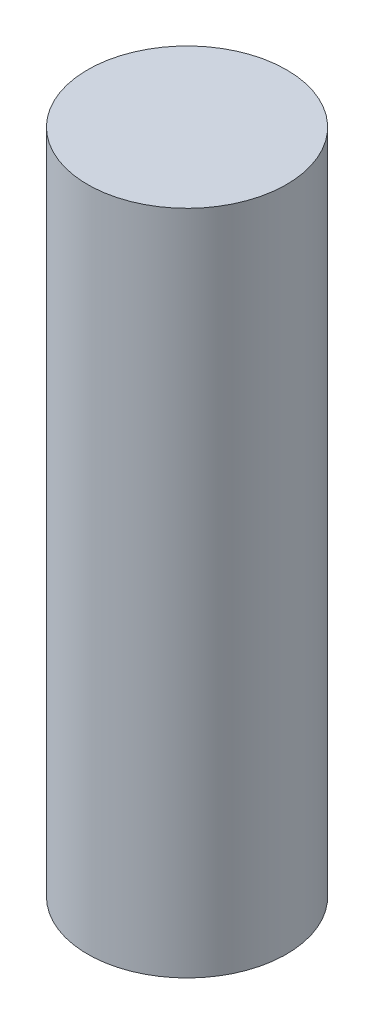
ISO-10303-21;
HEADER;
FILE_DESCRIPTION(('STEP AP214'),'2;1');
FILE_NAME('part.step','',(''),(''),'','','');
FILE_SCHEMA(('AUTOMOTIVE_DESIGN { 1 0 10303 214 1 1 1 1 }'));
ENDSEC;
DATA;
#1=APPLICATION_CONTEXT('core data for automotive mechanical design processes');
#2=APPLICATION_PROTOCOL_DEFINITION('international standard','automotive_design',2000,#1);
#3=PRODUCT_CONTEXT('',#1,'mechanical');
#4=PRODUCT('Part','Part','',(#3));
#5=PRODUCT_RELATED_PRODUCT_CATEGORY('part','',(#4));
#6=PRODUCT_DEFINITION_FORMATION('','',#4);
#7=PRODUCT_DEFINITION_CONTEXT('part definition',#1,'design');
#8=PRODUCT_DEFINITION('design','',#6,#7);
#9=PRODUCT_DEFINITION_SHAPE('','',#8);
#10=(LENGTH_UNIT() NAMED_UNIT(*) SI_UNIT(.MILLI.,.METRE.));
#11=(NAMED_UNIT(*) PLANE_ANGLE_UNIT() SI_UNIT($,.RADIAN.));
#12=(NAMED_UNIT(*) SI_UNIT($,.STERADIAN.) SOLID_ANGLE_UNIT());
#13=UNCERTAINTY_MEASURE_WITH_UNIT(LENGTH_MEASURE(1.E-05),#10,'distance_accuracy_value','');
#14=(GEOMETRIC_REPRESENTATION_CONTEXT(3) GLOBAL_UNCERTAINTY_ASSIGNED_CONTEXT((#13)) GLOBAL_UNIT_ASSIGNED_CONTEXT((#10,
#11,#12)) REPRESENTATION_CONTEXT('',''));
#15=CARTESIAN_POINT('',(0.,0.,0.));
#16=DIRECTION('',(0.,0.,1.));
#17=DIRECTION('',(1.,0.,0.));
#18=AXIS2_PLACEMENT_3D('',#15,#16,#17);
#19=CARTESIAN_POINT('',(0.,68.75,0.));
#20=DIRECTION('',(0.,-1.,0.));
#21=DIRECTION('',(0.,0.,-1.));
#22=AXIS2_PLACEMENT_3D('',#19,#20,#21);
#23=CYLINDRICAL_SURFACE('',#22,10.25);
#24=CARTESIAN_POINT('',(0.,68.75,0.));
#25=DIRECTION('',(0.,-1.,0.));
#26=DIRECTION('',(0.,0.,-1.));
#27=AXIS2_PLACEMENT_3D('',#24,#25,#26);
#28=CIRCLE('',#27,10.25);
#29=CARTESIAN_POINT('',(0.,68.75,-10.25));
#30=VERTEX_POINT('',#29);
#31=EDGE_CURVE('E10',#30,#30,#28,.T.);
#32=ORIENTED_EDGE('',*,*,#31,.T.);
#33=EDGE_LOOP('',(#32));
#34=FACE_BOUND('',#33,.T.);
#35=CARTESIAN_POINT('',(0.,0.0499999999999996,0.));
#36=DIRECTION('',(0.,-1.,0.));
#37=DIRECTION('',(0.,0.,-1.));
#38=AXIS2_PLACEMENT_3D('',#35,#36,#37);
#39=CIRCLE('',#38,10.25);
#40=CARTESIAN_POINT('',(0.,0.0499999999999996,-10.25));
#41=VERTEX_POINT('',#40);
#42=EDGE_CURVE('E43',#41,#41,#39,.T.);
#43=ORIENTED_EDGE('',*,*,#42,.F.);
#44=EDGE_LOOP('',(#43));
#45=FACE_BOUND('',#44,.T.);
#46=ADVANCED_FACE('F40',(#34,#45),#23,.T.);
#47=CARTESIAN_POINT('',(0.,68.75,0.));
#48=DIRECTION('',(0.,-1.,0.));
#49=DIRECTION('',(0.,0.,-1.));
#50=AXIS2_PLACEMENT_3D('',#47,#48,#49);
#51=PLANE('',#50);
#52=ORIENTED_EDGE('',*,*,#31,.F.);
#53=EDGE_LOOP('',(#52));
#54=FACE_BOUND('',#53,.T.);
#55=ADVANCED_FACE('F55',(#54),#51,.F.);
#56=CARTESIAN_POINT('',(0.,0.0499999999999996,0.));
#57=DIRECTION('',(0.,-1.,0.));
#58=DIRECTION('',(0.,0.,-1.));
#59=AXIS2_PLACEMENT_3D('',#56,#57,#58);
#60=PLANE('',#59);
#61=ORIENTED_EDGE('',*,*,#42,.T.);
#62=EDGE_LOOP('',(#61));
#63=FACE_BOUND('',#62,.T.);
#64=ADVANCED_FACE('F52',(#63),#60,.T.);
#65=CLOSED_SHELL('',(#46,#55,#64));
#66=MANIFOLD_SOLID_BREP('B2',#65);
#67=ADVANCED_BREP_SHAPE_REPRESENTATION('',(#18,#66),#14);
#68=SHAPE_DEFINITION_REPRESENTATION(#9,#67);
ENDSEC;
END-ISO-10303-21;
